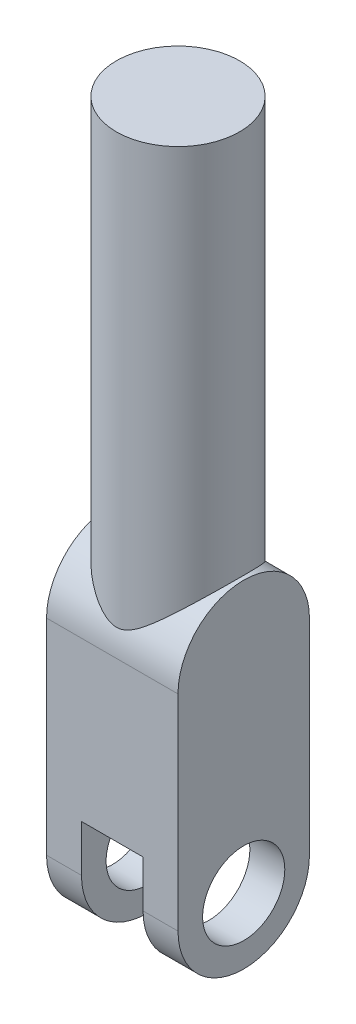
ISO-10303-21;
HEADER;
FILE_DESCRIPTION(('STEP AP214'),'2;1');
FILE_NAME('part.step','',(''),(''),'','','');
FILE_SCHEMA(('AUTOMOTIVE_DESIGN { 1 0 10303 214 1 1 1 1 }'));
ENDSEC;
DATA;
#1=APPLICATION_CONTEXT('core data for automotive mechanical design processes');
#2=APPLICATION_PROTOCOL_DEFINITION('international standard','automotive_design',2000,#1);
#3=PRODUCT_CONTEXT('',#1,'mechanical');
#4=PRODUCT('Part','Part','',(#3));
#5=PRODUCT_RELATED_PRODUCT_CATEGORY('part','',(#4));
#6=PRODUCT_DEFINITION_FORMATION('','',#4);
#7=PRODUCT_DEFINITION_CONTEXT('part definition',#1,'design');
#8=PRODUCT_DEFINITION('design','',#6,#7);
#9=PRODUCT_DEFINITION_SHAPE('','',#8);
#10=(LENGTH_UNIT() NAMED_UNIT(*) SI_UNIT(.MILLI.,.METRE.));
#11=(NAMED_UNIT(*) PLANE_ANGLE_UNIT() SI_UNIT($,.RADIAN.));
#12=(NAMED_UNIT(*) SI_UNIT($,.STERADIAN.) SOLID_ANGLE_UNIT());
#13=UNCERTAINTY_MEASURE_WITH_UNIT(LENGTH_MEASURE(1.E-05),#10,'distance_accuracy_value','');
#14=(GEOMETRIC_REPRESENTATION_CONTEXT(3) GLOBAL_UNCERTAINTY_ASSIGNED_CONTEXT((#13)) GLOBAL_UNIT_ASSIGNED_CONTEXT((#10,
#11,#12)) REPRESENTATION_CONTEXT('',''));
#15=CARTESIAN_POINT('',(0.,0.,0.));
#16=DIRECTION('',(0.,0.,1.));
#17=DIRECTION('',(1.,0.,0.));
#18=AXIS2_PLACEMENT_3D('',#15,#16,#17);
#19=CARTESIAN_POINT('',(16.,-110.,16.));
#20=DIRECTION('',(0.,0.,-1.));
#21=DIRECTION('',(0.,1.,0.));
#22=AXIS2_PLACEMENT_3D('',#19,#20,#21);
#23=PLANE('',#22);
#24=DIRECTION('',(0.,-1.,0.));
#25=VECTOR('',#24,1.);
#26=CARTESIAN_POINT('',(-7.5,-110.,16.));
#27=LINE('',#26,#25);
#28=CARTESIAN_POINT('',(-7.5,-148.629294233824,16.));
#29=VERTEX_POINT('',#28);
#30=CARTESIAN_POINT('',(-7.5,-160.,16.));
#31=VERTEX_POINT('',#30);
#32=EDGE_CURVE('E129',#29,#31,#27,.T.);
#33=ORIENTED_EDGE('',*,*,#32,.F.);
#34=DIRECTION('',(1.,0.,0.));
#35=VECTOR('',#34,1.);
#36=CARTESIAN_POINT('',(-7.5,-148.629294233824,16.));
#37=LINE('',#36,#35);
#38=CARTESIAN_POINT('',(7.5,-148.629294233824,16.));
#39=VERTEX_POINT('',#38);
#40=EDGE_CURVE('E120',#29,#39,#37,.T.);
#41=ORIENTED_EDGE('',*,*,#40,.T.);
#42=DIRECTION('',(0.,-1.,0.));
#43=VECTOR('',#42,1.);
#44=CARTESIAN_POINT('',(7.5,-110.,16.));
#45=LINE('',#44,#43);
#46=CARTESIAN_POINT('',(7.5,-160.,16.));
#47=VERTEX_POINT('',#46);
#48=EDGE_CURVE('E109',#39,#47,#45,.T.);
#49=ORIENTED_EDGE('',*,*,#48,.T.);
#50=DIRECTION('',(-1.,0.,0.));
#51=VECTOR('',#50,1.);
#52=CARTESIAN_POINT('',(16.,-160.,16.));
#53=LINE('',#52,#51);
#54=CARTESIAN_POINT('',(16.,-160.,16.));
#55=VERTEX_POINT('',#54);
#56=EDGE_CURVE('E157',#55,#47,#53,.T.);
#57=ORIENTED_EDGE('',*,*,#56,.F.);
#58=DIRECTION('',(0.,-1.,0.));
#59=VECTOR('',#58,1.);
#60=CARTESIAN_POINT('',(16.,-110.,16.));
#61=LINE('',#60,#59);
#62=CARTESIAN_POINT('',(16.,-110.,16.));
#63=VERTEX_POINT('',#62);
#64=EDGE_CURVE('E90',#63,#55,#61,.T.);
#65=ORIENTED_EDGE('',*,*,#64,.F.);
#66=DIRECTION('',(-1.,0.,0.));
#67=VECTOR('',#66,1.);
#68=CARTESIAN_POINT('',(16.,-110.,16.));
#69=LINE('',#68,#67);
#70=CARTESIAN_POINT('',(-16.,-110.,16.));
#71=VERTEX_POINT('',#70);
#72=EDGE_CURVE('E159',#63,#71,#69,.T.);
#73=ORIENTED_EDGE('',*,*,#72,.T.);
#74=DIRECTION('',(0.,-1.,0.));
#75=VECTOR('',#74,1.);
#76=CARTESIAN_POINT('',(-16.,-110.,16.));
#77=LINE('',#76,#75);
#78=CARTESIAN_POINT('',(-16.,-160.,16.));
#79=VERTEX_POINT('',#78);
#80=EDGE_CURVE('E133',#71,#79,#77,.T.);
#81=ORIENTED_EDGE('',*,*,#80,.T.);
#82=EDGE_CURVE('E156',#31,#79,#53,.T.);
#83=ORIENTED_EDGE('',*,*,#82,.F.);
#84=EDGE_LOOP('',(#33,#41,#49,#57,#65,#73,#81,#83));
#85=FACE_BOUND('',#84,.T.);
#86=ADVANCED_FACE('F37',(#85),#23,.F.);
#87=CARTESIAN_POINT('',(16.,-160.,0.));
#88=DIRECTION('',(-1.,0.,0.));
#89=DIRECTION('',(0.,0.,1.));
#90=AXIS2_PLACEMENT_3D('',#87,#88,#89);
#91=CYLINDRICAL_SURFACE('',#90,16.);
#92=CARTESIAN_POINT('',(-7.5,-160.,0.));
#93=DIRECTION('',(1.,0.,0.));
#94=DIRECTION('',(0.,0.,-1.));
#95=AXIS2_PLACEMENT_3D('',#92,#93,#94);
#96=CIRCLE('',#95,16.);
#97=CARTESIAN_POINT('',(-7.5,-160.,-16.));
#98=VERTEX_POINT('',#97);
#99=EDGE_CURVE('E115',#31,#98,#96,.T.);
#100=ORIENTED_EDGE('',*,*,#99,.F.);
#101=ORIENTED_EDGE('',*,*,#82,.T.);
#102=CARTESIAN_POINT('',(-16.,-160.,0.));
#103=DIRECTION('',(1.,0.,0.));
#104=DIRECTION('',(0.,0.,-1.));
#105=AXIS2_PLACEMENT_3D('',#102,#103,#104);
#106=CIRCLE('',#105,16.);
#107=CARTESIAN_POINT('',(-16.,-160.,-16.));
#108=VERTEX_POINT('',#107);
#109=EDGE_CURVE('E147',#79,#108,#106,.T.);
#110=ORIENTED_EDGE('',*,*,#109,.T.);
#111=DIRECTION('',(-1.,0.,0.));
#112=VECTOR('',#111,1.);
#113=CARTESIAN_POINT('',(16.,-160.,-16.));
#114=LINE('',#113,#112);
#115=EDGE_CURVE('E152',#98,#108,#114,.T.);
#116=ORIENTED_EDGE('',*,*,#115,.F.);
#117=EDGE_LOOP('',(#100,#101,#110,#116));
#118=FACE_BOUND('',#117,.T.);
#119=ADVANCED_FACE('F183',(#118),#91,.T.);
#120=CARTESIAN_POINT('',(16.,-110.,-16.));
#121=DIRECTION('',(0.,0.,1.));
#122=DIRECTION('',(0.,-1.,0.));
#123=AXIS2_PLACEMENT_3D('',#120,#121,#122);
#124=PLANE('',#123);
#125=DIRECTION('',(0.,1.,0.));
#126=VECTOR('',#125,1.);
#127=CARTESIAN_POINT('',(-7.5,-110.,-16.));
#128=LINE('',#127,#126);
#129=CARTESIAN_POINT('',(-7.5,-148.629294233824,-16.));
#130=VERTEX_POINT('',#129);
#131=EDGE_CURVE('E11',#98,#130,#128,.T.);
#132=ORIENTED_EDGE('',*,*,#131,.F.);
#133=ORIENTED_EDGE('',*,*,#115,.T.);
#134=DIRECTION('',(0.,1.,0.));
#135=VECTOR('',#134,1.);
#136=CARTESIAN_POINT('',(-16.,-110.,-16.));
#137=LINE('',#136,#135);
#138=CARTESIAN_POINT('',(-16.,-110.,-16.));
#139=VERTEX_POINT('',#138);
#140=EDGE_CURVE('E82',#108,#139,#137,.T.);
#141=ORIENTED_EDGE('',*,*,#140,.T.);
#142=DIRECTION('',(-1.,0.,0.));
#143=VECTOR('',#142,1.);
#144=CARTESIAN_POINT('',(16.,-110.,-16.));
#145=LINE('',#144,#143);
#146=CARTESIAN_POINT('',(16.,-110.,-16.));
#147=VERTEX_POINT('',#146);
#148=EDGE_CURVE('E143',#147,#139,#145,.T.);
#149=ORIENTED_EDGE('',*,*,#148,.F.);
#150=DIRECTION('',(0.,1.,0.));
#151=VECTOR('',#150,1.);
#152=CARTESIAN_POINT('',(16.,-110.,-16.));
#153=LINE('',#152,#151);
#154=CARTESIAN_POINT('',(16.,-160.,-16.));
#155=VERTEX_POINT('',#154);
#156=EDGE_CURVE('E62',#155,#147,#153,.T.);
#157=ORIENTED_EDGE('',*,*,#156,.F.);
#158=CARTESIAN_POINT('',(7.5,-160.,-16.));
#159=VERTEX_POINT('',#158);
#160=EDGE_CURVE('E153',#155,#159,#114,.T.);
#161=ORIENTED_EDGE('',*,*,#160,.T.);
#162=DIRECTION('',(0.,1.,0.));
#163=VECTOR('',#162,1.);
#164=CARTESIAN_POINT('',(7.5,-110.,-16.));
#165=LINE('',#164,#163);
#166=CARTESIAN_POINT('',(7.5,-148.629294233824,-16.));
#167=VERTEX_POINT('',#166);
#168=EDGE_CURVE('E165',#159,#167,#165,.T.);
#169=ORIENTED_EDGE('',*,*,#168,.T.);
#170=DIRECTION('',(1.,0.,0.));
#171=VECTOR('',#170,1.);
#172=CARTESIAN_POINT('',(-7.5,-148.629294233824,-16.));
#173=LINE('',#172,#171);
#174=EDGE_CURVE('E46',#167,#130,#173,.F.);
#175=ORIENTED_EDGE('',*,*,#174,.T.);
#176=EDGE_LOOP('',(#132,#133,#141,#149,#157,#161,#169,#175));
#177=FACE_BOUND('',#176,.T.);
#178=ADVANCED_FACE('F179',(#177),#124,.F.);
#179=CARTESIAN_POINT('',(16.,-110.,0.));
#180=DIRECTION('',(-1.,0.,0.));
#181=DIRECTION('',(0.,0.,1.));
#182=AXIS2_PLACEMENT_3D('',#179,#180,#181);
#183=CYLINDRICAL_SURFACE('',#182,16.);
#184=CARTESIAN_POINT('',(0.,-104.432235637169,14.9999999999998));
#185=CARTESIAN_POINT('',(0.196077869624428,-104.432228740098,14.9999984672257));
#186=CARTESIAN_POINT('',(0.392184089349883,-104.421799901874,14.9961390111988));
#187=CARTESIAN_POINT('',(0.782083075169535,-104.380927963761,14.9808704578941));
#188=CARTESIAN_POINT('',(0.975873989424364,-104.350469809667,14.9694556819304));
#189=CARTESIAN_POINT('',(1.36002047488409,-104.271639266392,14.9394660296112));
#190=CARTESIAN_POINT('',(1.55035746435442,-104.223189626653,14.9208602628289));
#191=CARTESIAN_POINT('',(1.92584190572123,-104.111307296555,14.8770597650684));
#192=CARTESIAN_POINT('',(2.11098581211691,-104.047864635699,14.8518606482517));
#193=CARTESIAN_POINT('',(2.5766272808915,-103.870541413803,14.7798240885997));
#194=CARTESIAN_POINT('',(2.85321689566134,-103.748173610322,14.7287278990549));
#195=CARTESIAN_POINT('',(3.39392145979331,-103.483633975139,14.6136179944293));
#196=CARTESIAN_POINT('',(3.65802580236948,-103.341445696037,14.5495935312258));
#197=CARTESIAN_POINT('',(4.17605183490291,-103.043387305547,14.4094677098553));
#198=CARTESIAN_POINT('',(4.42994166969477,-102.887478598149,14.3333317628888));
#199=CARTESIAN_POINT('',(4.92834883957089,-102.566814087403,14.1696926160436));
#200=CARTESIAN_POINT('',(5.17286301736845,-102.402055347848,14.082185629717));
#201=CARTESIAN_POINT('',(5.65077102627842,-102.068905768967,13.8972524656789));
#202=CARTESIAN_POINT('',(5.88426305549381,-101.900582188099,13.7999578368777));
#203=CARTESIAN_POINT('',(6.34400708830312,-101.560657558957,13.5947388998107));
#204=CARTESIAN_POINT('',(6.57026004230142,-101.389056945681,13.4868159945608));
#205=CARTESIAN_POINT('',(7.01628401112953,-101.04409418163,13.2602552603427));
#206=CARTESIAN_POINT('',(7.23604982919358,-100.870730760558,13.1416091344552));
#207=CARTESIAN_POINT('',(7.66922259480224,-100.523701630608,12.8936141978894));
#208=CARTESIAN_POINT('',(7.88262893919517,-100.350035894701,12.7642643764066));
#209=CARTESIAN_POINT('',(8.51290909246749,-99.8308021107959,12.3603958570294));
#210=CARTESIAN_POINT('',(8.92056520592331,-99.4864310870946,12.0696917309287));
#211=CARTESIAN_POINT('',(9.71001178766456,-98.808767630784,11.4441680369958));
#212=CARTESIAN_POINT('',(10.0918174224855,-98.4754687616238,11.109374682031));
#213=CARTESIAN_POINT('',(10.72894361307,-97.9130531037492,10.4895747679062));
#214=CARTESIAN_POINT('',(10.990867763666,-97.6798319629977,10.2150577239518));
#215=CARTESIAN_POINT('',(11.497642717797,-97.2256845062163,9.64109740047515));
#216=CARTESIAN_POINT('',(11.7424935673937,-97.004758157017,9.34165418820554));
#217=CARTESIAN_POINT('',(12.2125623461694,-96.5784914039254,8.71811592347004));
#218=CARTESIAN_POINT('',(12.4378071187859,-96.3731297412857,8.39405575159332));
#219=CARTESIAN_POINT('',(12.8663431957712,-95.9808936411332,7.72115373820279));
#220=CARTESIAN_POINT('',(13.0696395696331,-95.794014935392,7.37231765025581));
#221=CARTESIAN_POINT('',(13.4116177109132,-95.4787027812032,6.72556054334119));
#222=CARTESIAN_POINT('',(13.554955795426,-95.3461863363754,6.43208487559411));
#223=CARTESIAN_POINT('',(13.824224158195,-95.0967587539513,5.8308880546733));
#224=CARTESIAN_POINT('',(13.9501583729029,-94.9798440877114,5.52317014393494));
#225=CARTESIAN_POINT('',(14.1828790482904,-94.7634575707638,4.89470898267573));
#226=CARTESIAN_POINT('',(14.2896711064163,-94.6639806212013,4.57396957358824));
#227=CARTESIAN_POINT('',(14.4824532257866,-94.4841938479201,3.92102079792728));
#228=CARTESIAN_POINT('',(14.5684430604521,-94.4038842329732,3.58881130646605));
#229=CARTESIAN_POINT('',(14.7186193554373,-94.2635125412751,2.91257172181255));
#230=CARTESIAN_POINT('',(14.7826391532336,-94.2036052595503,2.56847216608203));
#231=CARTESIAN_POINT('',(14.886685223124,-94.1061942212109,1.87350836635942));
#232=CARTESIAN_POINT('',(14.9267114184788,-94.0686905362501,1.52264410073533));
#233=CARTESIAN_POINT('',(14.9818853040481,-94.0169841860516,0.817407650640689));
#234=CARTESIAN_POINT('',(14.9970441631047,-94.0027710601639,0.463037112954843));
#235=CARTESIAN_POINT('',(15.0021709398834,-93.997964779616,-0.246027411058435));
#236=CARTESIAN_POINT('',(14.9921413156954,-94.0073693201584,-0.600721362447888));
#237=CARTESIAN_POINT('',(14.9497782434946,-94.0470747261685,-1.26560202798084));
#238=CARTESIAN_POINT('',(14.920200937672,-94.0747932697315,-1.57612611470702));
#239=CARTESIAN_POINT('',(14.8421301065283,-94.1479137495143,-2.1926470037784));
#240=CARTESIAN_POINT('',(14.7936383819978,-94.1933140023058,-2.49864423423557));
#241=CARTESIAN_POINT('',(14.6785239372777,-94.3009983876945,-3.10418078907191));
#242=CARTESIAN_POINT('',(14.6119003034685,-94.3632833710687,-3.4037197872166));
#243=CARTESIAN_POINT('',(14.461523387822,-94.5037121941942,-3.99466076993956));
#244=CARTESIAN_POINT('',(14.3777691406523,-94.5818569276612,-4.2860622949084));
#245=CARTESIAN_POINT('',(14.1914269546313,-94.7554790582277,-4.86823297601602));
#246=CARTESIAN_POINT('',(14.0883356547918,-94.8514186748186,-5.15870248585444));
#247=CARTESIAN_POINT('',(13.8664420153912,-95.0575594982405,-5.72846452115565));
#248=CARTESIAN_POINT('',(13.7476336412981,-95.1677661825275,-6.00775269964962));
#249=CARTESIAN_POINT('',(13.4956515885442,-95.4010158666103,-6.55423002322256));
#250=CARTESIAN_POINT('',(13.3624767327178,-95.5240599182513,-6.82141817429482));
#251=CARTESIAN_POINT('',(13.0830322547711,-95.7816036090443,-7.34315221832826));
#252=CARTESIAN_POINT('',(12.936759829918,-95.9161056997872,-7.59769538719969));
#253=CARTESIAN_POINT('',(12.5530174817955,-96.2679325803916,-8.222993663327));
#254=CARTESIAN_POINT('',(12.3077203639993,-96.4919151255098,-8.5852446655359));
#255=CARTESIAN_POINT('',(11.7932708686452,-96.9589271028451,-9.27930743450258));
#256=CARTESIAN_POINT('',(11.5241079945557,-97.2019649103704,-9.6111056757892));
#257=CARTESIAN_POINT('',(10.9643772032449,-97.7035742205781,-10.2450781053152));
#258=CARTESIAN_POINT('',(10.6737637312583,-97.9621785539944,-10.5471858737036));
#259=CARTESIAN_POINT('',(10.0740100309582,-98.4906323121209,-11.1214523831574));
#260=CARTESIAN_POINT('',(9.76487256715906,-98.7604800570459,-11.3936155760316));
#261=CARTESIAN_POINT('',(9.12162671686894,-99.3146519885082,-11.9151864281364));
#262=CARTESIAN_POINT('',(8.78708744275879,-99.599169413113,-12.1638557636259));
#263=CARTESIAN_POINT('',(8.10079778460857,-100.172121596232,-12.631291595835));
#264=CARTESIAN_POINT('',(7.74904319056826,-100.460557300375,-12.8500507279033));
#265=CARTESIAN_POINT('',(7.02854913558519,-101.036004210033,-13.2578554503834));
#266=CARTESIAN_POINT('',(6.6598360671031,-101.323016907136,-13.4469453181266));
#267=CARTESIAN_POINT('',(6.09242852615924,-101.747597432211,-13.7085949152397));
#268=CARTESIAN_POINT('',(5.90093443091557,-101.888112774007,-13.7921357758119));
#269=CARTESIAN_POINT('',(5.51269112608023,-102.166014770228,-13.9518572973447));
#270=CARTESIAN_POINT('',(5.31594254611047,-102.303401795883,-14.0280388351345));
#271=CARTESIAN_POINT('',(4.92326972117421,-102.569092018393,-14.1705175563858));
#272=CARTESIAN_POINT('',(4.72753639091414,-102.697545358577,-14.2370594872917));
#273=CARTESIAN_POINT('',(4.33000824631234,-102.948391980261,-14.3629559873671));
#274=CARTESIAN_POINT('',(4.12821473255863,-103.070786547322,-14.4223120851385));
#275=CARTESIAN_POINT('',(3.71773993455658,-103.307209024676,-14.5335335313861));
#276=CARTESIAN_POINT('',(3.50905954659908,-103.421238017526,-14.5853998499319));
#277=CARTESIAN_POINT('',(3.08410913568768,-103.63774682295,-14.6811361035492));
#278=CARTESIAN_POINT('',(2.86784134887933,-103.740230001406,-14.7250083713934));
#279=CARTESIAN_POINT('',(2.33082899049489,-103.97080044123,-14.8212801479257));
#280=CARTESIAN_POINT('',(2.00549175694998,-104.090685194768,-14.8691115756707));
#281=CARTESIAN_POINT('',(1.50584656001295,-104.234391593743,-14.9251616533067));
#282=CARTESIAN_POINT('',(1.33755743870686,-104.276246287565,-14.941219402106));
#283=CARTESIAN_POINT('',(0.99771600294408,-104.34599022068,-14.9677507908584));
#284=CARTESIAN_POINT('',(0.826165741090662,-104.373887961059,-14.9782278302364));
#285=CARTESIAN_POINT('',(0.478729374970397,-104.41438839651,-14.9933796250433));
#286=CARTESIAN_POINT('',(0.302815889031759,-104.426788637559,-14.9979775958562));
#287=CARTESIAN_POINT('',(-0.0494439211604515,-104.434800463509,-15.0009524291695));
#288=CARTESIAN_POINT('',(-0.225790220739647,-104.430412984223,-14.9993296384397));
#289=CARTESIAN_POINT('',(-0.577359431322522,-104.40513229292,-14.9899176132081));
#290=CARTESIAN_POINT('',(-0.75258039088215,-104.384215645034,-14.9821196231715));
#291=CARTESIAN_POINT('',(-1.10014766425558,-104.327179424676,-14.9606157022355));
#292=CARTESIAN_POINT('',(-1.27249331027918,-104.291056370251,-14.946908418212));
#293=CARTESIAN_POINT('',(-1.65871843106905,-104.194167690094,-14.9095829825959));
#294=CARTESIAN_POINT('',(-1.87142595392024,-104.129400323121,-14.8842970892629));
#295=CARTESIAN_POINT('',(-2.28976474194596,-103.982979732541,-14.8257095087283));
#296=CARTESIAN_POINT('',(-2.49539281007455,-103.901318993679,-14.792404252916));
#297=CARTESIAN_POINT('',(-2.90032678181179,-103.724765318655,-14.7183770082864));
#298=CARTESIAN_POINT('',(-3.0996075011705,-103.629826195001,-14.6776289722742));
#299=CARTESIAN_POINT('',(-3.49168192184455,-103.430115989224,-14.5893302780404));
#300=CARTESIAN_POINT('',(-3.68447262594375,-103.325340446832,-14.5417765286311));
#301=CARTESIAN_POINT('',(-4.08059862786464,-103.099087918694,-14.4358693442957));
#302=CARTESIAN_POINT('',(-4.28339933585647,-102.976950479682,-14.3769370754093));
#303=CARTESIAN_POINT('',(-4.68276754590825,-102.726471309375,-14.2518570218689));
#304=CARTESIAN_POINT('',(-4.87933574447296,-102.598130275429,-14.1857100471779));
#305=CARTESIAN_POINT('',(-5.46118540958597,-102.20630502665,-13.9766135886024));
#306=CARTESIAN_POINT('',(-5.83826847586744,-101.936222905573,-13.8231018423591));
#307=CARTESIAN_POINT('',(-6.5746153312349,-101.388055647186,-13.4884399549757));
#308=CARTESIAN_POINT('',(-6.93385334992266,-101.109959802647,-13.3072512994214));
#309=CARTESIAN_POINT('',(-7.63565023701238,-100.552362190366,-12.9173471781005));
#310=CARTESIAN_POINT('',(-7.97821566695123,-100.272861024262,-12.7086426631834));
#311=CARTESIAN_POINT('',(-8.69144518112967,-99.6802689382394,-12.2337954804433));
#312=CARTESIAN_POINT('',(-9.05985450059956,-99.3676109282962,-11.963707635808));
#313=CARTESIAN_POINT('',(-9.77532610516959,-98.7517120123661,-11.386580832435));
#314=CARTESIAN_POINT('',(-10.1223821698526,-98.4484738630969,-11.079531182647));
#315=CARTESIAN_POINT('',(-10.791916757976,-97.857478377762,-10.4284232036878));
#316=CARTESIAN_POINT('',(-11.114457384314,-97.5696825073157,-10.0844641012103));
#317=CARTESIAN_POINT('',(-11.7326097178282,-97.0140141585299,-9.35805437852206));
#318=CARTESIAN_POINT('',(-12.028221564206,-96.7461415772033,-8.97560395730407));
#319=CARTESIAN_POINT('',(-12.4997813399025,-96.3164944709735,-8.29867679779758));
#320=CARTESIAN_POINT('',(-12.6841225822849,-96.1478492844672,-8.01436508585381));
#321=CARTESIAN_POINT('',(-13.0361253978846,-95.8248219778902,-7.42807137731859));
#322=CARTESIAN_POINT('',(-13.2037970163957,-95.6704312719675,-7.12610019892425));
#323=CARTESIAN_POINT('',(-13.5206206322488,-95.3779798483274,-6.50494896612495));
#324=CARTESIAN_POINT('',(-13.6697719171934,-95.2399197587881,-6.18576825042013));
#325=CARTESIAN_POINT('',(-13.9474524363752,-94.9823858879667,-5.53126716830704));
#326=CARTESIAN_POINT('',(-14.0759811774673,-94.8629125511503,-5.19594641619253));
#327=CARTESIAN_POINT('',(-14.3114585797377,-94.6436990544628,-4.50731473966353));
#328=CARTESIAN_POINT('',(-14.4181735671526,-94.5441727723065,-4.15385511714188));
#329=CARTESIAN_POINT('',(-14.6062412378693,-94.3685845906567,-3.43451395836102));
#330=CARTESIAN_POINT('',(-14.6875937932105,-94.2925228095483,-3.06863235943973));
#331=CARTESIAN_POINT('',(-14.8230406291393,-94.1657977169364,-2.3278902392425));
#332=CARTESIAN_POINT('',(-14.8771619864215,-94.1151091764123,-1.95303902685566));
#333=CARTESIAN_POINT('',(-14.9569259390168,-94.0403810559106,-1.19770654909145));
#334=CARTESIAN_POINT('',(-14.982573548208,-94.016336784205,-0.817226286881436));
#335=CARTESIAN_POINT('',(-15.0031126689988,-93.9970820295292,-0.111089598669545));
#336=CARTESIAN_POINT('',(-15.0019889441455,-93.9981358306268,0.214360049815199));
#337=CARTESIAN_POINT('',(-14.9786307676475,-94.0200324784984,0.863805848827531));
#338=CARTESIAN_POINT('',(-14.9563987797223,-94.0408730157991,1.18780216455145));
#339=CARTESIAN_POINT('',(-14.8912432539282,-94.1019184596632,1.83184434654877));
#340=CARTESIAN_POINT('',(-14.8483197939871,-94.1421232932971,2.15189022769557));
#341=CARTESIAN_POINT('',(-14.7425528795866,-94.2411130269125,2.7857462936513));
#342=CARTESIAN_POINT('',(-14.6797088608928,-94.2998984531745,3.09955630156638));
#343=CARTESIAN_POINT('',(-14.5378715455966,-94.4324344800307,3.7072884860362));
#344=CARTESIAN_POINT('',(-14.4595731952935,-94.5055403150954,4.00151498997917));
#345=CARTESIAN_POINT('',(-14.2866125799875,-94.6668227883314,4.58083919592443));
#346=CARTESIAN_POINT('',(-14.191951324103,-94.7549984971232,4.86593745959104));
#347=CARTESIAN_POINT('',(-13.9874446221097,-94.9451936511044,5.4258866813014));
#348=CARTESIAN_POINT('',(-13.8775980297421,-95.0472141413507,5.70073686378251));
#349=CARTESIAN_POINT('',(-13.6439299484377,-95.2638232251281,6.23934260673322));
#350=CARTESIAN_POINT('',(-13.5201055633473,-95.3784144231301,6.50309585235596));
#351=CARTESIAN_POINT('',(-13.2023706013702,-95.6717973281578,7.132350111194));
#352=CARTESIAN_POINT('',(-13.0015874274817,-95.856659069404,7.49158123518712));
#353=CARTESIAN_POINT('',(-12.5767933731926,-96.2461445771729,8.18472048775729));
#354=CARTESIAN_POINT('',(-12.3527741727542,-96.450775420533,8.51861947113718));
#355=CARTESIAN_POINT('',(-11.8838643042269,-96.8768672682056,9.16146413219172));
#356=CARTESIAN_POINT('',(-11.6389251988307,-97.0983671949285,9.47034848657433));
#357=CARTESIAN_POINT('',(-11.1310779030579,-97.554580880587,10.0623666021878));
#358=CARTESIAN_POINT('',(-10.8681702437308,-97.7892942489715,10.345501123863));
#359=CARTESIAN_POINT('',(-10.2375240130524,-98.3475842566063,10.9750389283313));
#360=CARTESIAN_POINT('',(-9.86364245996941,-98.6750981425752,11.3118117394206));
#361=CARTESIAN_POINT('',(-9.09037025716916,-99.3418493454049,11.9421213077795));
#362=CARTESIAN_POINT('',(-8.69096577161921,-99.6810929743726,12.2356343241939));
#363=CARTESIAN_POINT('',(-8.07395421131424,-100.19307727593,12.64404794508));
#364=CARTESIAN_POINT('',(-7.86536286778468,-100.364208256741,12.7748430628042));
#365=CARTESIAN_POINT('',(-7.44204750931772,-100.706533636718,13.0259938915539));
#366=CARTESIAN_POINT('',(-7.22732404685764,-100.877728028809,13.1463505391207));
#367=CARTESIAN_POINT('',(-6.79164206396578,-101.218880928914,13.3766317442076));
#368=CARTESIAN_POINT('',(-6.57068728699642,-101.38884010492,13.4865623989568));
#369=CARTESIAN_POINT('',(-6.12200412862249,-101.726124645171,13.696071480704));
#370=CARTESIAN_POINT('',(-5.8942767478105,-101.893450392951,13.795651427252));
#371=CARTESIAN_POINT('',(-5.45970679597558,-102.203325316644,13.9728198944275));
#372=CARTESIAN_POINT('',(-5.25372688397592,-102.346396964309,14.0516077862494));
#373=CARTESIAN_POINT('',(-4.83532792691569,-102.627325153858,14.2010199327354));
#374=CARTESIAN_POINT('',(-4.62290886549219,-102.765181682487,14.271644166652));
#375=CARTESIAN_POINT('',(-4.19086068127346,-103.033320733366,14.4044341287305));
#376=CARTESIAN_POINT('',(-3.97123530165757,-103.16360709331,14.4666041645536));
#377=CARTESIAN_POINT('',(-3.52380514274987,-103.413441243972,14.5820510323173));
#378=CARTESIAN_POINT('',(-3.29600273883803,-103.532992118512,14.6353304219397));
#379=CARTESIAN_POINT('',(-2.73241276632236,-103.804690158289,14.7529027056086));
#380=CARTESIAN_POINT('',(-2.39169587228597,-103.949244190508,14.81232593144));
#381=CARTESIAN_POINT('',(-1.86643322269458,-104.130010279761,14.8844726111924));
#382=CARTESIAN_POINT('',(-1.68921766007344,-104.184208275045,14.9056737777668));
#383=CARTESIAN_POINT('',(-1.33041545701504,-104.278106335178,14.9419696116129));
#384=CARTESIAN_POINT('',(-1.14883201697931,-104.317816689949,14.9570686138033));
#385=CARTESIAN_POINT('',(-0.806370333075288,-104.376332911185,14.9791596560679));
#386=CARTESIAN_POINT('',(-0.645897581722056,-104.397196467846,14.9869548597132));
#387=CARTESIAN_POINT('',(-0.323622714035387,-104.425148608046,14.9973748876414));
#388=CARTESIAN_POINT('',(-0.161821011684266,-104.43224132925,15.0000012649823));
#389=CARTESIAN_POINT('',(0.,-104.432235637169,14.9999999999998));
#390=B_SPLINE_CURVE_WITH_KNOTS('',3,(#184,#185,#186,#187,#188,#189,#190,#191,#192,#193,#194,
#195,#196,#197,#198,#199,#200,#201,#202,#203,#204,#205,#206,#207,#208,#209,#210,#211,#212,#213,
#214,#215,#216,#217,#218,#219,#220,#221,#222,#223,#224,#225,#226,#227,#228,#229,#230,#231,#232,
#233,#234,#235,#236,#237,#238,#239,#240,#241,#242,#243,#244,#245,#246,#247,#248,#249,#250,#251,
#252,#253,#254,#255,#256,#257,#258,#259,#260,#261,#262,#263,#264,#265,#266,#267,#268,#269,#270,
#271,#272,#273,#274,#275,#276,#277,#278,#279,#280,#281,#282,#283,#284,#285,#286,#287,#288,#289,
#290,#291,#292,#293,#294,#295,#296,#297,#298,#299,#300,#301,#302,#303,#304,#305,#306,#307,#308,
#309,#310,#311,#312,#313,#314,#315,#316,#317,#318,#319,#320,#321,#322,#323,#324,#325,#326,#327,
#328,#329,#330,#331,#332,#333,#334,#335,#336,#337,#338,#339,#340,#341,#342,#343,#344,#345,#346,
#347,#348,#349,#350,#351,#352,#353,#354,#355,#356,#357,#358,#359,#360,#361,#362,#363,#364,#365,
#366,#367,#368,#369,#370,#371,#372,#373,#374,#375,#376,#377,#378,#379,#380,#381,#382,#383,#384,
#385,#386,#387,#388,#389),.UNSPECIFIED.,.T.,.F.,(4,2,2,2,2,2,2,2,2,2,2,2,2,2,2,2,2,2,2,2,2,2,2,
2,2,2,2,2,2,2,2,2,2,2,2,2,2,2,2,2,2,2,2,2,2,2,2,2,2,2,2,2,2,2,2,2,2,2,2,2,2,2,2,2,2,2,2,2,2,2,2,
2,2,2,2,2,2,2,2,2,2,2,2,2,2,2,2,2,2,2,2,2,2,2,2,2,2,2,2,2,2,2,4),(0.,0.587983346107363,
1.17640913145595,1.76739123436798,2.35876745724528,3.27728196614151,4.19656326390435,
5.11851866497228,6.04078185893511,6.9519842169723,7.86306644997064,8.77485975378059,
9.68673926135573,11.5075446652036,13.3272723715838,14.6623267844171,15.9973775952947,
17.3305708008386,18.6634554126245,19.7198992453476,20.7761037364553,21.8319988722969,
22.8879055084894,23.9516537060706,25.0154053058417,26.0786790044184,27.1418489444305,
28.0802269916463,29.0185157202255,29.9568517354826,30.8952406417736,31.8627199053135,
32.8305717141372,33.7985028874507,34.7666416844283,36.2389017747827,37.7118126308181,
39.1879468789194,40.6638613752817,42.1766466748308,43.6898037922907,45.2006807987931,
45.9558805441378,46.7109901996609,47.4409428669636,48.1707399816853,48.900442488788,
49.6299317165531,50.6761500213088,51.1980662762945,51.7196642473712,52.2480072945564,
52.7763208902481,53.3053849018823,53.8345701242428,54.504786801451,55.1753022776061,
55.8482109270924,56.5214261906654,57.2529980255315,57.9844878144431,59.4486944547679,
60.9149575253655,62.3806387995769,64.0396706762295,65.6991835793218,67.3543418446405,
69.009491553542,70.1440480561614,71.2779166651678,72.4118288757119,73.5457681973699,
74.6912823590448,75.8368023000694,76.9811809584348,78.1253580737608,79.100461346023,
80.0754508199249,81.0504366218708,82.0254500419996,82.9638549464497,83.9022019990663,
84.8406199211357,85.779232638498,87.1306640843529,88.4825811137596,89.8377179002366,
91.1928146537962,92.9915174807786,94.7912037844024,95.6905235765105,96.5897625978458,
97.4884724495676,98.3870501780463,99.1754565934018,99.9638650123942,100.75187019686,
101.53964829388,102.660544389533,103.219559129927,103.778176050631,104.263578415782,
104.748834911595),.UNSPECIFIED.);
#391=CARTESIAN_POINT('',(0.,-104.432235637169,14.9999999999998));
#392=VERTEX_POINT('',#391);
#393=EDGE_CURVE('E161',#392,#392,#390,.T.);
#394=ORIENTED_EDGE('',*,*,#393,.F.);
#395=EDGE_LOOP('',(#394));
#396=FACE_BOUND('',#395,.T.);
#397=CARTESIAN_POINT('',(-16.,-110.,0.));
#398=DIRECTION('',(1.,0.,0.));
#399=DIRECTION('',(0.,0.,-1.));
#400=AXIS2_PLACEMENT_3D('',#397,#398,#399);
#401=CIRCLE('',#400,16.);
#402=EDGE_CURVE('E130',#139,#71,#401,.T.);
#403=ORIENTED_EDGE('',*,*,#402,.T.);
#404=ORIENTED_EDGE('',*,*,#72,.F.);
#405=CARTESIAN_POINT('',(16.,-110.,0.));
#406=DIRECTION('',(1.,0.,0.));
#407=DIRECTION('',(0.,0.,-1.));
#408=AXIS2_PLACEMENT_3D('',#405,#406,#407);
#409=CIRCLE('',#408,16.);
#410=EDGE_CURVE('E138',#147,#63,#409,.T.);
#411=ORIENTED_EDGE('',*,*,#410,.F.);
#412=ORIENTED_EDGE('',*,*,#148,.T.);
#413=EDGE_LOOP('',(#403,#404,#411,#412));
#414=FACE_BOUND('',#413,.T.);
#415=ADVANCED_FACE('F174',(#396,#414),#183,.T.);
#416=ORIENTED_EDGE('',*,*,#56,.T.);
#417=CARTESIAN_POINT('',(7.5,-160.,0.));
#418=DIRECTION('',(1.,0.,0.));
#419=DIRECTION('',(0.,0.,-1.));
#420=AXIS2_PLACEMENT_3D('',#417,#418,#419);
#421=CIRCLE('',#420,16.);
#422=EDGE_CURVE('E112',#47,#159,#421,.T.);
#423=ORIENTED_EDGE('',*,*,#422,.T.);
#424=ORIENTED_EDGE('',*,*,#160,.F.);
#425=CARTESIAN_POINT('',(16.,-160.,0.));
#426=DIRECTION('',(1.,0.,0.));
#427=DIRECTION('',(0.,0.,-1.));
#428=AXIS2_PLACEMENT_3D('',#425,#426,#427);
#429=CIRCLE('',#428,16.);
#430=EDGE_CURVE('E141',#55,#155,#429,.T.);
#431=ORIENTED_EDGE('',*,*,#430,.F.);
#432=EDGE_LOOP('',(#416,#423,#424,#431));
#433=FACE_BOUND('',#432,.T.);
#434=ADVANCED_FACE('F178',(#433),#91,.T.);
#435=CARTESIAN_POINT('',(16.,-110.,0.));
#436=DIRECTION('',(1.,0.,0.));
#437=DIRECTION('',(0.,0.,-1.));
#438=AXIS2_PLACEMENT_3D('',#435,#436,#437);
#439=PLANE('',#438);
#440=CARTESIAN_POINT('',(16.,-160.,0.));
#441=DIRECTION('',(1.,0.,0.));
#442=DIRECTION('',(0.,0.,-1.));
#443=AXIS2_PLACEMENT_3D('',#440,#441,#442);
#444=CIRCLE('',#443,10.);
#445=CARTESIAN_POINT('',(16.,-160.,-10.));
#446=VERTEX_POINT('',#445);
#447=EDGE_CURVE('E125',#446,#446,#444,.T.);
#448=ORIENTED_EDGE('',*,*,#447,.F.);
#449=EDGE_LOOP('',(#448));
#450=FACE_BOUND('',#449,.T.);
#451=ORIENTED_EDGE('',*,*,#410,.T.);
#452=ORIENTED_EDGE('',*,*,#64,.T.);
#453=ORIENTED_EDGE('',*,*,#430,.T.);
#454=ORIENTED_EDGE('',*,*,#156,.T.);
#455=EDGE_LOOP('',(#451,#452,#453,#454));
#456=FACE_BOUND('',#455,.T.);
#457=ADVANCED_FACE('F186',(#450,#456),#439,.T.);
#458=CARTESIAN_POINT('',(-16.,-110.,0.));
#459=DIRECTION('',(1.,0.,0.));
#460=DIRECTION('',(0.,0.,-1.));
#461=AXIS2_PLACEMENT_3D('',#458,#459,#460);
#462=PLANE('',#461);
#463=CARTESIAN_POINT('',(-16.,-160.,0.));
#464=DIRECTION('',(1.,0.,0.));
#465=DIRECTION('',(0.,0.,-1.));
#466=AXIS2_PLACEMENT_3D('',#463,#464,#465);
#467=CIRCLE('',#466,10.);
#468=CARTESIAN_POINT('',(-16.,-160.,-10.));
#469=VERTEX_POINT('',#468);
#470=EDGE_CURVE('E220',#469,#469,#467,.T.);
#471=ORIENTED_EDGE('',*,*,#470,.T.);
#472=EDGE_LOOP('',(#471));
#473=FACE_BOUND('',#472,.T.);
#474=ORIENTED_EDGE('',*,*,#402,.F.);
#475=ORIENTED_EDGE('',*,*,#140,.F.);
#476=ORIENTED_EDGE('',*,*,#109,.F.);
#477=ORIENTED_EDGE('',*,*,#80,.F.);
#478=EDGE_LOOP('',(#474,#475,#476,#477));
#479=FACE_BOUND('',#478,.T.);
#480=ADVANCED_FACE('F190',(#473,#479),#462,.F.);
#481=CARTESIAN_POINT('',(0.,0.,0.));
#482=DIRECTION('',(0.,1.,0.));
#483=DIRECTION('',(0.,0.,1.));
#484=AXIS2_PLACEMENT_3D('',#481,#482,#483);
#485=CYLINDRICAL_SURFACE('',#484,14.9999999999998);
#486=CARTESIAN_POINT('',(0.,0.,0.));
#487=DIRECTION('',(0.,1.,0.));
#488=DIRECTION('',(0.,0.,1.));
#489=AXIS2_PLACEMENT_3D('',#486,#487,#488);
#490=CIRCLE('',#489,15.);
#491=CARTESIAN_POINT('',(0.,0.,15.));
#492=VERTEX_POINT('',#491);
#493=EDGE_CURVE('E162',#492,#492,#490,.T.);
#494=ORIENTED_EDGE('',*,*,#493,.F.);
#495=EDGE_LOOP('',(#494));
#496=FACE_BOUND('',#495,.T.);
#497=ORIENTED_EDGE('',*,*,#393,.T.);
#498=EDGE_LOOP('',(#497));
#499=FACE_BOUND('',#498,.T.);
#500=ADVANCED_FACE('F172',(#496,#499),#485,.T.);
#501=CARTESIAN_POINT('',(0.,0.,0.));
#502=DIRECTION('',(0.,1.,0.));
#503=DIRECTION('',(0.,0.,1.));
#504=AXIS2_PLACEMENT_3D('',#501,#502,#503);
#505=PLANE('',#504);
#506=ORIENTED_EDGE('',*,*,#493,.T.);
#507=EDGE_LOOP('',(#506));
#508=FACE_BOUND('',#507,.T.);
#509=ADVANCED_FACE('F39',(#508),#505,.T.);
#510=CARTESIAN_POINT('',(-7.5,-160.,0.));
#511=DIRECTION('',(1.,0.,0.));
#512=DIRECTION('',(0.,0.,-1.));
#513=AXIS2_PLACEMENT_3D('',#510,#511,#512);
#514=CYLINDRICAL_SURFACE('',#513,19.6288804984124);
#515=CARTESIAN_POINT('',(-7.5,-160.,0.));
#516=DIRECTION('',(1.,0.,0.));
#517=DIRECTION('',(0.,0.,-1.));
#518=AXIS2_PLACEMENT_3D('',#515,#516,#517);
#519=CIRCLE('',#518,19.6288804984124);
#520=EDGE_CURVE('E124',#130,#29,#519,.T.);
#521=ORIENTED_EDGE('',*,*,#520,.F.);
#522=ORIENTED_EDGE('',*,*,#174,.F.);
#523=CARTESIAN_POINT('',(7.5,-160.,0.));
#524=DIRECTION('',(1.,0.,0.));
#525=DIRECTION('',(0.,0.,-1.));
#526=AXIS2_PLACEMENT_3D('',#523,#524,#525);
#527=CIRCLE('',#526,19.6288804984124);
#528=EDGE_CURVE('E53',#167,#39,#527,.T.);
#529=ORIENTED_EDGE('',*,*,#528,.T.);
#530=ORIENTED_EDGE('',*,*,#40,.F.);
#531=EDGE_LOOP('',(#521,#522,#529,#530));
#532=FACE_BOUND('',#531,.T.);
#533=ADVANCED_FACE('F119',(#532),#514,.F.);
#534=CARTESIAN_POINT('',(-7.5,-160.,0.));
#535=DIRECTION('',(1.,0.,0.));
#536=DIRECTION('',(0.,0.,-1.));
#537=AXIS2_PLACEMENT_3D('',#534,#535,#536);
#538=PLANE('',#537);
#539=CARTESIAN_POINT('',(-7.5,-160.,0.));
#540=DIRECTION('',(1.,0.,0.));
#541=DIRECTION('',(0.,0.,-1.));
#542=AXIS2_PLACEMENT_3D('',#539,#540,#541);
#543=CIRCLE('',#542,10.);
#544=CARTESIAN_POINT('',(-7.5,-160.,-10.));
#545=VERTEX_POINT('',#544);
#546=EDGE_CURVE('E217',#545,#545,#543,.T.);
#547=ORIENTED_EDGE('',*,*,#546,.F.);
#548=EDGE_LOOP('',(#547));
#549=FACE_BOUND('',#548,.T.);
#550=ORIENTED_EDGE('',*,*,#32,.T.);
#551=ORIENTED_EDGE('',*,*,#99,.T.);
#552=ORIENTED_EDGE('',*,*,#131,.T.);
#553=ORIENTED_EDGE('',*,*,#520,.T.);
#554=EDGE_LOOP('',(#550,#551,#552,#553));
#555=FACE_BOUND('',#554,.T.);
#556=ADVANCED_FACE('F199',(#549,#555),#538,.T.);
#557=CARTESIAN_POINT('',(7.5,-160.,0.));
#558=DIRECTION('',(1.,0.,0.));
#559=DIRECTION('',(0.,0.,-1.));
#560=AXIS2_PLACEMENT_3D('',#557,#558,#559);
#561=PLANE('',#560);
#562=CARTESIAN_POINT('',(7.5,-160.,0.));
#563=DIRECTION('',(1.,0.,0.));
#564=DIRECTION('',(0.,0.,-1.));
#565=AXIS2_PLACEMENT_3D('',#562,#563,#564);
#566=CIRCLE('',#565,10.);
#567=CARTESIAN_POINT('',(7.5,-160.,-10.));
#568=VERTEX_POINT('',#567);
#569=EDGE_CURVE('E41',#568,#568,#566,.T.);
#570=ORIENTED_EDGE('',*,*,#569,.T.);
#571=EDGE_LOOP('',(#570));
#572=FACE_BOUND('',#571,.T.);
#573=ORIENTED_EDGE('',*,*,#528,.F.);
#574=ORIENTED_EDGE('',*,*,#168,.F.);
#575=ORIENTED_EDGE('',*,*,#422,.F.);
#576=ORIENTED_EDGE('',*,*,#48,.F.);
#577=EDGE_LOOP('',(#573,#574,#575,#576));
#578=FACE_BOUND('',#577,.T.);
#579=ADVANCED_FACE('F110',(#572,#578),#561,.F.);
#580=CARTESIAN_POINT('',(-27.5,-160.,0.));
#581=DIRECTION('',(1.,0.,0.));
#582=DIRECTION('',(0.,0.,-1.));
#583=AXIS2_PLACEMENT_3D('',#580,#581,#582);
#584=CYLINDRICAL_SURFACE('',#583,10.);
#585=ORIENTED_EDGE('',*,*,#447,.T.);
#586=EDGE_LOOP('',(#585));
#587=FACE_BOUND('',#586,.T.);
#588=ORIENTED_EDGE('',*,*,#569,.F.);
#589=EDGE_LOOP('',(#588));
#590=FACE_BOUND('',#589,.T.);
#591=ADVANCED_FACE('F202',(#587,#590),#584,.F.);
#592=ORIENTED_EDGE('',*,*,#546,.T.);
#593=EDGE_LOOP('',(#592));
#594=FACE_BOUND('',#593,.T.);
#595=ORIENTED_EDGE('',*,*,#470,.F.);
#596=EDGE_LOOP('',(#595));
#597=FACE_BOUND('',#596,.T.);
#598=ADVANCED_FACE('F207',(#594,#597),#584,.F.);
#599=CLOSED_SHELL('',(#86,#119,#178,#415,#434,#457,#480,#500,#509,#533,#556,#579,#591,#598));
#600=MANIFOLD_SOLID_BREP('B2',#599);
#601=ADVANCED_BREP_SHAPE_REPRESENTATION('',(#18,#600),#14);
#602=SHAPE_DEFINITION_REPRESENTATION(#9,#601);
ENDSEC;
END-ISO-10303-21;
